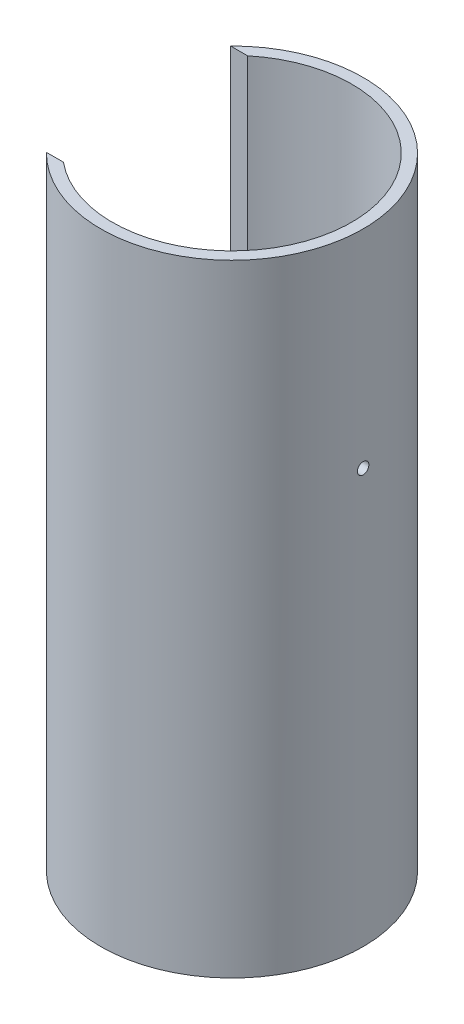
ISO-10303-21;
HEADER;
FILE_DESCRIPTION(('STEP AP214'),'2;1');
FILE_NAME('part.step','',(''),(''),'','','');
FILE_SCHEMA(('AUTOMOTIVE_DESIGN { 1 0 10303 214 1 1 1 1 }'));
ENDSEC;
DATA;
#1=APPLICATION_CONTEXT('core data for automotive mechanical design processes');
#2=APPLICATION_PROTOCOL_DEFINITION('international standard','automotive_design',2000,#1);
#3=PRODUCT_CONTEXT('',#1,'mechanical');
#4=PRODUCT('Part','Part','',(#3));
#5=PRODUCT_RELATED_PRODUCT_CATEGORY('part','',(#4));
#6=PRODUCT_DEFINITION_FORMATION('','',#4);
#7=PRODUCT_DEFINITION_CONTEXT('part definition',#1,'design');
#8=PRODUCT_DEFINITION('design','',#6,#7);
#9=PRODUCT_DEFINITION_SHAPE('','',#8);
#10=(LENGTH_UNIT() NAMED_UNIT(*) SI_UNIT(.MILLI.,.METRE.));
#11=(NAMED_UNIT(*) PLANE_ANGLE_UNIT() SI_UNIT($,.RADIAN.));
#12=(NAMED_UNIT(*) SI_UNIT($,.STERADIAN.) SOLID_ANGLE_UNIT());
#13=UNCERTAINTY_MEASURE_WITH_UNIT(LENGTH_MEASURE(1.E-05),#10,'distance_accuracy_value','');
#14=(GEOMETRIC_REPRESENTATION_CONTEXT(3) GLOBAL_UNCERTAINTY_ASSIGNED_CONTEXT((#13)) GLOBAL_UNIT_ASSIGNED_CONTEXT((#10,
#11,#12)) REPRESENTATION_CONTEXT('',''));
#15=CARTESIAN_POINT('',(0.,0.,0.));
#16=DIRECTION('',(0.,0.,1.));
#17=DIRECTION('',(1.,0.,0.));
#18=AXIS2_PLACEMENT_3D('',#15,#16,#17);
#19=CARTESIAN_POINT('',(0.,270.,0.));
#20=DIRECTION('',(0.,-1.,0.));
#21=DIRECTION('',(0.,0.,-1.));
#22=AXIS2_PLACEMENT_3D('',#19,#20,#21);
#23=CYLINDRICAL_SURFACE('',#22,52.);
#24=CARTESIAN_POINT('',(0.,0.,0.));
#25=DIRECTION('',(0.,1.,0.));
#26=DIRECTION('',(0.,0.,1.));
#27=AXIS2_PLACEMENT_3D('',#24,#25,#26);
#28=CIRCLE('',#27,52.);
#29=CARTESIAN_POINT('',(0.,0.,52.));
#30=VERTEX_POINT('',#29);
#31=EDGE_CURVE('E100',#30,#30,#28,.T.);
#32=ORIENTED_EDGE('',*,*,#31,.F.);
#33=EDGE_LOOP('',(#32));
#34=FACE_BOUND('',#33,.T.);
#35=CARTESIAN_POINT('',(0.,270.,0.));
#36=DIRECTION('',(0.,1.,0.));
#37=DIRECTION('',(0.,0.,1.));
#38=AXIS2_PLACEMENT_3D('',#35,#36,#37);
#39=CIRCLE('',#38,52.);
#40=CARTESIAN_POINT('',(-33.2264954516725,270.,39.9999999999998));
#41=VERTEX_POINT('',#40);
#42=CARTESIAN_POINT('',(-33.2264954516721,270.,-40.0000000000002));
#43=VERTEX_POINT('',#42);
#44=EDGE_CURVE('E109',#41,#43,#39,.T.);
#45=ORIENTED_EDGE('',*,*,#44,.T.);
#46=DIRECTION('',(0.,-1.,0.));
#47=VECTOR('',#46,1.);
#48=CARTESIAN_POINT('',(-33.2264954516721,270.,-40.0000000000002));
#49=LINE('',#48,#47);
#50=CARTESIAN_POINT('',(-33.2264954516721,80.4884974931799,-40.0000000000002));
#51=VERTEX_POINT('',#50);
#52=EDGE_CURVE('E88',#43,#51,#49,.T.);
#53=ORIENTED_EDGE('',*,*,#52,.T.);
#54=CARTESIAN_POINT('',(0.,138.038475772933,0.));
#55=DIRECTION('',(-0.866025403784442,0.499999999999995,0.));
#56=DIRECTION('',(-0.499999999999995,-0.866025403784442,0.));
#57=AXIS2_PLACEMENT_3D('',#54,#55,#56);
#58=ELLIPSE('',#57,104.000000000001,52.);
#59=CARTESIAN_POINT('',(-33.2264954516725,80.4884974931792,39.9999999999998));
#60=VERTEX_POINT('',#59);
#61=EDGE_CURVE('E83',#51,#60,#58,.T.);
#62=ORIENTED_EDGE('',*,*,#61,.T.);
#63=DIRECTION('',(0.,-1.,0.));
#64=VECTOR('',#63,1.);
#65=CARTESIAN_POINT('',(-33.2264954516725,270.,39.9999999999998));
#66=LINE('',#65,#64);
#67=EDGE_CURVE('E112',#60,#41,#66,.F.);
#68=ORIENTED_EDGE('',*,*,#67,.T.);
#69=EDGE_LOOP('',(#45,#53,#62,#68));
#70=FACE_BOUND('',#69,.T.);
#71=CARTESIAN_POINT('',(51.9398690795424,180.,2.50000000000002));
#72=CARTESIAN_POINT('',(51.9398698877251,179.85966099347,2.49999380392899));
#73=CARTESIAN_POINT('',(51.9404439763664,179.719222293602,2.4881432912713));
#74=CARTESIAN_POINT('',(51.9426787211842,179.442218624341,2.44103704050154));
#75=CARTESIAN_POINT('',(51.9443406596585,179.305658425168,2.40575368031589));
#76=CARTESIAN_POINT('',(51.9485624146755,179.040464549569,2.31279385035021));
#77=CARTESIAN_POINT('',(51.9511217756166,178.911826889931,2.25512874170481));
#78=CARTESIAN_POINT('',(51.9568494111344,178.666092159121,2.11905962490106));
#79=CARTESIAN_POINT('',(51.9600175413525,178.54899236189,2.04066053178103));
#80=CARTESIAN_POINT('',(51.9666091620992,178.329511521978,1.86526599192956));
#81=CARTESIAN_POINT('',(51.9700328616201,178.227142730359,1.76825522141113));
#82=CARTESIAN_POINT('',(51.9767478581374,178.040134137084,1.55842150104542));
#83=CARTESIAN_POINT('',(51.9800391497406,177.955495057002,1.44559790795081));
#84=CARTESIAN_POINT('',(51.9861199972316,177.806315731241,1.20727830652829));
#85=CARTESIAN_POINT('',(51.9889093183989,177.741784877867,1.08177641245468));
#86=CARTESIAN_POINT('',(51.9936698065947,177.634714123814,0.821704220111246));
#87=CARTESIAN_POINT('',(51.9956409794713,177.592174065948,0.687133986668528));
#88=CARTESIAN_POINT('',(51.9985416517946,177.530324408697,0.412856414303844));
#89=CARTESIAN_POINT('',(51.9994719632304,177.510996700201,0.273153167713358));
#90=CARTESIAN_POINT('',(52.0001887949155,177.496064504932,-0.0075177206885541));
#91=CARTESIAN_POINT('',(51.9999753236431,177.500459842308,-0.148485353119899));
#92=CARTESIAN_POINT('',(51.9984293313726,177.532833925389,-0.427560838715849));
#93=CARTESIAN_POINT('',(51.9970977354395,177.560793175883,-0.565670959250697));
#94=CARTESIAN_POINT('',(51.9934665575373,177.639471209598,-0.835235187038885));
#95=CARTESIAN_POINT('',(51.9911669717355,177.690190082937,-0.96668926793487));
#96=CARTESIAN_POINT('',(51.9858572705386,177.812969886158,-1.21927270336453));
#97=CARTESIAN_POINT('',(51.9828468593226,177.885039704755,-1.34039773065875));
#98=CARTESIAN_POINT('',(51.9764545554062,178.048469101553,-1.56883745605855));
#99=CARTESIAN_POINT('',(51.9730726602916,178.139828805123,-1.67615206440024));
#100=CARTESIAN_POINT('',(51.9663142337273,178.339354831265,-1.8740383746559));
#101=CARTESIAN_POINT('',(51.9629377111681,178.447538067229,-1.96459302421276));
#102=CARTESIAN_POINT('',(51.9565741314063,178.677580791009,-2.12625755002522));
#103=CARTESIAN_POINT('',(51.9535870743014,178.799440282259,-2.19736742139875));
#104=CARTESIAN_POINT('',(51.94833953179,179.05338658627,-2.31812231322526));
#105=CARTESIAN_POINT('',(51.9460790677379,179.185473699476,-2.36776670283095));
#106=CARTESIAN_POINT('',(51.942540446289,179.456121168953,-2.4441700692522));
#107=CARTESIAN_POINT('',(51.9412622820613,179.594681480201,-2.47092920521391));
#108=CARTESIAN_POINT('',(51.939833657698,179.874193605354,-2.50078140028988));
#109=CARTESIAN_POINT('',(51.9396820700089,180.015142886521,-2.5038981223882));
#110=CARTESIAN_POINT('',(51.9405207496073,180.295562461242,-2.48643875871233));
#111=CARTESIAN_POINT('',(51.9415110134084,180.43503275931,-2.46586274527748));
#112=CARTESIAN_POINT('',(51.9445207524595,180.708468903372,-2.40162161027664));
#113=CARTESIAN_POINT('',(51.9465397453045,180.8424372976,-2.35796731052076));
#114=CARTESIAN_POINT('',(51.9513789686177,181.10114523462,-2.24881974125971));
#115=CARTESIAN_POINT('',(51.9541992033679,181.225884728086,-2.1833263550426));
#116=CARTESIAN_POINT('',(51.960325782896,181.462702849845,-2.03229896610143));
#117=CARTESIAN_POINT('',(51.9636325125735,181.574771327912,-1.94674906318047));
#118=CARTESIAN_POINT('',(51.970358016835,181.782964122,-1.7580603311612));
#119=CARTESIAN_POINT('',(51.9737767920844,181.879088343321,-1.65492139760152));
#120=CARTESIAN_POINT('',(51.9803443448003,182.05274346704,-1.43388073718953));
#121=CARTESIAN_POINT('',(51.9834928990073,182.130259088058,-1.31596699737229));
#122=CARTESIAN_POINT('',(51.9891619658802,182.264392166152,-1.06878463620905));
#123=CARTESIAN_POINT('',(51.9916824811251,182.32100970905,-0.939516061496665));
#124=CARTESIAN_POINT('',(51.9958103326942,182.411712730715,-0.673350427699059));
#125=CARTESIAN_POINT('',(51.9974180657573,182.445807999797,-0.536456711320945));
#126=CARTESIAN_POINT('',(51.9995407347622,182.490530699689,-0.258879848855558));
#127=CARTESIAN_POINT('',(52.0000556762552,182.501158249712,-0.118196722021564));
#128=CARTESIAN_POINT('',(51.9999347532676,182.498642680547,0.162813731558451));
#129=CARTESIAN_POINT('',(51.9993000496874,182.485523540545,0.303141274096285));
#130=CARTESIAN_POINT('',(51.9969535815984,182.435936541774,0.57959915102851));
#131=CARTESIAN_POINT('',(51.9952418150458,182.3994686387,0.715729477457988));
#132=CARTESIAN_POINT('',(51.9909338311244,182.304224114436,0.97993395733898));
#133=CARTESIAN_POINT('',(51.9883376059352,182.24544729599,1.10800803954506));
#134=CARTESIAN_POINT('',(51.9825527493823,182.107257755848,1.35247133076744));
#135=CARTESIAN_POINT('',(51.9793641365847,182.027845680856,1.46886090581475));
#136=CARTESIAN_POINT('',(51.9727497888821,181.850554703308,1.68677064394442));
#137=CARTESIAN_POINT('',(51.9693238430144,181.7526592342,1.78827732145014));
#138=CARTESIAN_POINT('',(51.9626223164292,181.541188436009,1.97344668824445));
#139=CARTESIAN_POINT('',(51.9593467729423,181.42760925217,2.05710497783809));
#140=CARTESIAN_POINT('',(51.9533134122306,181.18791110784,2.20423909171157));
#141=CARTESIAN_POINT('',(51.9505560754622,181.061780674497,2.26769622389242));
#142=CARTESIAN_POINT('',(51.9458778079842,180.800737426243,2.37245748075221));
#143=CARTESIAN_POINT('',(51.9439558887213,180.665835209619,2.41378780167561));
#144=CARTESIAN_POINT('',(51.9416746391871,180.441744296266,2.46226792204854));
#145=CARTESIAN_POINT('',(51.9410005351568,180.354007459926,2.4763994172873));
#146=CARTESIAN_POINT('',(51.9400974998671,180.177527048551,2.49526741248901));
#147=CARTESIAN_POINT('',(51.939868568257,180.088783474308,2.50000391985613));
#148=CARTESIAN_POINT('',(51.9398690795424,180.,2.50000000000002));
#149=B_SPLINE_CURVE_WITH_KNOTS('',3,(#71,#72,#73,#74,#75,#76,#77,#78,#79,#80,#81,#82,#83,#84,
#85,#86,#87,#88,#89,#90,#91,#92,#93,#94,#95,#96,#97,#98,#99,#100,#101,#102,#103,#104,#105,#106,
#107,#108,#109,#110,#111,#112,#113,#114,#115,#116,#117,#118,#119,#120,#121,#122,#123,#124,#125,
#126,#127,#128,#129,#130,#131,#132,#133,#134,#135,#136,#137,#138,#139,#140,#141,#142,#143,#144,
#145,#146,#147,#148),.UNSPECIFIED.,.T.,.F.,(4,2,2,2,2,2,2,2,2,2,2,2,2,2,2,2,2,2,2,2,2,2,2,2,2,2,
2,2,2,2,2,2,2,2,2,2,2,2,4),(0.,0.420692928415116,0.841882641748107,1.26285883521012,
1.68373532461486,2.10495983835314,2.52620149199325,2.94763960850495,3.36907471258895,
3.79018082012403,4.21128380618504,4.63203874133232,5.05279534250337,5.47372735764895,
5.89466210859738,6.31602281151622,6.73738362022743,7.15875681143533,7.58012707235141,
8.00107554067587,8.42202272375188,8.84277269222273,9.263524909292,9.68461182065185,
10.1057012329367,10.5271352698503,10.9485675760408,11.3698165670418,11.7910634181597,
12.2118851354223,12.6327076512146,13.0535338880299,13.4743469378497,13.8955389658444,
14.3168346996087,14.7385191321554,15.1597032162891,15.425848817295,15.6919942085521),.UNSPECIFIED.);
#150=CARTESIAN_POINT('',(51.9398690795424,180.,2.50000000000002));
#151=VERTEX_POINT('',#150);
#152=EDGE_CURVE('E95',#151,#151,#149,.T.);
#153=ORIENTED_EDGE('',*,*,#152,.T.);
#154=EDGE_LOOP('',(#153));
#155=FACE_BOUND('',#154,.T.);
#156=ADVANCED_FACE('F36',(#34,#70,#155),#23,.F.);
#157=CARTESIAN_POINT('',(0.,270.,0.));
#158=DIRECTION('',(0.,-1.,0.));
#159=DIRECTION('',(0.,0.,-1.));
#160=AXIS2_PLACEMENT_3D('',#157,#158,#159);
#161=CYLINDRICAL_SURFACE('',#160,57.);
#162=DIRECTION('',(0.,-1.,0.));
#163=VECTOR('',#162,1.);
#164=CARTESIAN_POINT('',(-40.6078810084941,270.,39.9999999999998));
#165=LINE('',#164,#163);
#166=CARTESIAN_POINT('',(-40.6078810084941,67.7035626785089,39.9999999999998));
#167=VERTEX_POINT('',#166);
#168=CARTESIAN_POINT('',(-40.6078810084941,270.,39.9999999999998));
#169=VERTEX_POINT('',#168);
#170=EDGE_CURVE('E48',#167,#169,#165,.F.);
#171=ORIENTED_EDGE('',*,*,#170,.F.);
#172=CARTESIAN_POINT('',(0.,138.038475772933,0.));
#173=DIRECTION('',(-0.866025403784442,0.499999999999995,0.));
#174=DIRECTION('',(-0.499999999999995,-0.866025403784442,0.));
#175=AXIS2_PLACEMENT_3D('',#172,#173,#174);
#176=ELLIPSE('',#175,114.000000000001,57.);
#177=CARTESIAN_POINT('',(-40.6078810084937,67.7035626785097,-40.0000000000002));
#178=VERTEX_POINT('',#177);
#179=EDGE_CURVE('E55',#178,#167,#176,.T.);
#180=ORIENTED_EDGE('',*,*,#179,.F.);
#181=DIRECTION('',(0.,-1.,0.));
#182=VECTOR('',#181,1.);
#183=CARTESIAN_POINT('',(-40.6078810084937,270.,-40.0000000000002));
#184=LINE('',#183,#182);
#185=CARTESIAN_POINT('',(-40.6078810084937,270.,-40.0000000000002));
#186=VERTEX_POINT('',#185);
#187=EDGE_CURVE('E93',#186,#178,#184,.T.);
#188=ORIENTED_EDGE('',*,*,#187,.F.);
#189=CARTESIAN_POINT('',(0.,270.,0.));
#190=DIRECTION('',(0.,1.,0.));
#191=DIRECTION('',(0.,0.,1.));
#192=AXIS2_PLACEMENT_3D('',#189,#190,#191);
#193=CIRCLE('',#192,57.);
#194=EDGE_CURVE('E63',#169,#186,#193,.T.);
#195=ORIENTED_EDGE('',*,*,#194,.F.);
#196=EDGE_LOOP('',(#171,#180,#188,#195));
#197=FACE_BOUND('',#196,.T.);
#198=CARTESIAN_POINT('',(0.,0.,0.));
#199=DIRECTION('',(0.,1.,0.));
#200=DIRECTION('',(0.,0.,1.));
#201=AXIS2_PLACEMENT_3D('',#198,#199,#200);
#202=CIRCLE('',#201,57.);
#203=CARTESIAN_POINT('',(0.,0.,57.));
#204=VERTEX_POINT('',#203);
#205=EDGE_CURVE('E104',#204,#204,#202,.T.);
#206=ORIENTED_EDGE('',*,*,#205,.T.);
#207=EDGE_LOOP('',(#206));
#208=FACE_BOUND('',#207,.T.);
#209=CARTESIAN_POINT('',(57.,177.5,0.));
#210=CARTESIAN_POINT('',(56.9999992646389,177.500006201462,-0.140353692550606));
#211=CARTESIAN_POINT('',(56.9994760457185,177.511859184025,-0.280807435385509));
#212=CARTESIAN_POINT('',(56.9974391213871,177.558975819787,-0.55784178688696));
#213=CARTESIAN_POINT('',(56.9959242431764,177.594267193444,-0.69441760947785));
#214=CARTESIAN_POINT('',(56.9920754940514,177.68724956445,-0.95964282100244));
#215=CARTESIAN_POINT('',(56.9897420345578,177.7449293109,-1.08829615368288));
#216=CARTESIAN_POINT('',(56.9845190726591,177.881034229992,-1.33405911627805));
#217=CARTESIAN_POINT('',(56.9816297031697,177.959454445354,-1.45117149548272));
#218=CARTESIAN_POINT('',(56.9756174477692,178.134885790706,-1.67065838722621));
#219=CARTESIAN_POINT('',(56.9724943987938,178.231909977943,-1.77302245972415));
#220=CARTESIAN_POINT('',(56.9663681853318,178.441769691984,-1.96001826625343));
#221=CARTESIAN_POINT('',(56.9633650257015,178.554605858461,-2.04464928254801));
#222=CARTESIAN_POINT('',(56.9578161622023,178.79293806603,-2.19380288424851));
#223=CARTESIAN_POINT('',(56.9552706352591,178.918438974295,-2.25831769956301));
#224=CARTESIAN_POINT('',(56.9509259775338,179.178503809166,-2.36535759511149));
#225=CARTESIAN_POINT('',(56.9491268420516,179.313067678695,-2.40788281381657));
#226=CARTESIAN_POINT('',(56.9464792625189,179.587346058743,-2.4697098362051));
#227=CARTESIAN_POINT('',(56.9456302017576,179.727057167179,-2.48902670545226));
#228=CARTESIAN_POINT('',(56.9449766621707,180.007741397074,-2.50393516086315));
#229=CARTESIAN_POINT('',(56.9451721765699,180.148714510342,-2.4995269009079));
#230=CARTESIAN_POINT('',(56.9465851659826,180.427818728896,-2.46712281828866));
#231=CARTESIAN_POINT('',(56.9478019359677,180.565951727487,-2.43914326811985));
#232=CARTESIAN_POINT('',(56.9511191757347,180.835558308862,-2.36041604686029));
#233=CARTESIAN_POINT('',(56.9532196486079,180.967031868347,-2.30966829611988));
#234=CARTESIAN_POINT('',(56.9580683508879,181.219639967857,-2.18682659248046));
#235=CARTESIAN_POINT('',(56.9608168058029,181.340770888439,-2.11472520592463));
#236=CARTESIAN_POINT('',(56.9666514430658,181.569215636944,-1.95122836268527));
#237=CARTESIAN_POINT('',(56.969737627217,181.676529391088,-1.85983280298137));
#238=CARTESIAN_POINT('',(56.9759029930593,181.874388294845,-1.66025009398518));
#239=CARTESIAN_POINT('',(56.9789821666499,181.964919226267,-1.55204884844644));
#240=CARTESIAN_POINT('',(56.9847839272717,182.126533119827,-1.32197580343807));
#241=CARTESIAN_POINT('',(56.9875065142275,182.197616077851,-1.20010400107531));
#242=CARTESIAN_POINT('',(56.9922883255487,182.318314802743,-0.946141157730987));
#243=CARTESIAN_POINT('',(56.994347535123,182.367930090963,-0.814049888970679));
#244=CARTESIAN_POINT('',(56.9975702756469,182.444275866278,-0.543401334867235));
#245=CARTESIAN_POINT('',(56.9987338117641,182.471006485404,-0.404844086834084));
#246=CARTESIAN_POINT('',(57.0000334003163,182.500806651285,-0.125320177713949));
#247=CARTESIAN_POINT('',(57.0001703068932,182.503895867412,0.0156443826203608));
#248=CARTESIAN_POINT('',(56.9994034716879,182.48637684037,0.296089962558756));
#249=CARTESIAN_POINT('',(56.9984997325408,182.465768657208,0.435570985918628));
#250=CARTESIAN_POINT('',(56.9957539684182,182.40145610102,0.709035127866437));
#251=CARTESIAN_POINT('',(56.99391230758,182.3577606911,0.843020358335788));
#252=CARTESIAN_POINT('',(56.9894981105445,182.248523119304,1.10175455357909));
#253=CARTESIAN_POINT('',(56.986925571121,182.182980860996,1.22650347758088));
#254=CARTESIAN_POINT('',(56.9813370302305,182.031859627639,1.46331429765255));
#255=CARTESIAN_POINT('',(56.9783207370042,181.94626744807,1.57536776025048));
#256=CARTESIAN_POINT('',(56.9721854437107,181.757495345065,1.78352211174476));
#257=CARTESIAN_POINT('',(56.9690664431281,181.654315333343,1.87962292055898));
#258=CARTESIAN_POINT('',(56.9630748727783,181.433211962316,2.05321005421267));
#259=CARTESIAN_POINT('',(56.9602024721662,181.31527861709,2.13068366629651));
#260=CARTESIAN_POINT('',(56.9550306432213,181.068066869862,2.26473034035058));
#261=CARTESIAN_POINT('',(56.9527312128256,180.938788508705,2.32130347756349));
#262=CARTESIAN_POINT('',(56.94896581267,180.672603839812,2.41192107888779));
#263=CARTESIAN_POINT('',(56.9474995415243,180.535700310095,2.44597369026943));
#264=CARTESIAN_POINT('',(56.9455649478234,180.258112478422,2.49061027607693));
#265=CARTESIAN_POINT('',(56.9450966213312,180.117428191384,2.50119434308828));
#266=CARTESIAN_POINT('',(56.9452108324331,179.83639902865,2.49859246118059));
#267=CARTESIAN_POINT('',(56.94579248543,179.696053966899,2.48542652141344));
#268=CARTESIAN_POINT('',(56.9479392272305,179.419568619829,2.43573966059012));
#269=CARTESIAN_POINT('',(56.9495043179393,179.283428342656,2.39921869429163));
#270=CARTESIAN_POINT('',(56.9534413384817,179.019212175689,2.3038622948098));
#271=CARTESIAN_POINT('',(56.9558132776653,178.89113637937,2.24502660303452));
#272=CARTESIAN_POINT('',(56.9610965546845,178.646680500445,2.10671491993146));
#273=CARTESIAN_POINT('',(56.964007874907,178.530300036128,2.02723960254076));
#274=CARTESIAN_POINT('',(56.9700445042915,178.312439824711,1.84983512278238));
#275=CARTESIAN_POINT('',(56.9731699690179,178.210971082112,1.75189245242291));
#276=CARTESIAN_POINT('',(56.979281712617,178.025886047041,1.54033410922755));
#277=CARTESIAN_POINT('',(56.9822679569794,177.942274162785,1.42671457770706));
#278=CARTESIAN_POINT('',(56.9877664045194,177.795246230735,1.18695480328423));
#279=CARTESIAN_POINT('',(56.9902782047117,177.731847320358,1.06080405409163));
#280=CARTESIAN_POINT('',(56.9945383322885,177.627204405783,0.799733287089196));
#281=CARTESIAN_POINT('',(56.9962875641053,177.585934142807,0.664823876846485));
#282=CARTESIAN_POINT('',(56.9983610373897,177.537585640273,0.440892631949623));
#283=CARTESIAN_POINT('',(56.9989729596849,177.523508925801,0.353322375818431));
#284=CARTESIAN_POINT('',(56.9997926729901,177.504714151082,0.177181372298448));
#285=CARTESIAN_POINT('',(57.0000004642615,177.499996084781,0.0886106255567912));
#286=CARTESIAN_POINT('',(57.,177.5,0.));
#287=B_SPLINE_CURVE_WITH_KNOTS('',3,(#209,#210,#211,#212,#213,#214,#215,#216,#217,#218,#219,
#220,#221,#222,#223,#224,#225,#226,#227,#228,#229,#230,#231,#232,#233,#234,#235,#236,#237,#238,
#239,#240,#241,#242,#243,#244,#245,#246,#247,#248,#249,#250,#251,#252,#253,#254,#255,#256,#257,
#258,#259,#260,#261,#262,#263,#264,#265,#266,#267,#268,#269,#270,#271,#272,#273,#274,#275,#276,
#277,#278,#279,#280,#281,#282,#283,#284,#285,#286),.UNSPECIFIED.,.T.,.F.,(4,2,2,2,2,2,2,2,2,2,2,
2,2,2,2,2,2,2,2,2,2,2,2,2,2,2,2,2,2,2,2,2,2,2,2,2,2,2,4),(0.,0.420737623648742,
0.841973739655536,1.26299844408949,1.68392260818189,2.10514328760483,2.52638101243675,
2.94778124372887,3.36917882138138,3.79030270321808,4.21142385365134,4.6322545201255,
5.05308665879665,5.47406547067473,5.89504653040691,6.31638262612172,6.7377188110048,
7.15906438963619,7.58040753732041,8.00140009425088,8.42239158512447,8.84321975532689,
9.26404978309546,9.68515774509559,10.1062678209888,10.5276644869303,10.9490596358094,
11.3703022526837,11.7915432077157,12.2124294370345,12.6333164816779,13.0542084038773,
13.4750865845963,13.8962738204381,14.3175649123784,14.7392122487202,15.1603581271382,
15.4259859667941,15.6916136346473),.UNSPECIFIED.);
#288=CARTESIAN_POINT('',(57.,177.5,0.));
#289=VERTEX_POINT('',#288);
#290=EDGE_CURVE('E11',#289,#289,#287,.T.);
#291=ORIENTED_EDGE('',*,*,#290,.F.);
#292=EDGE_LOOP('',(#291));
#293=FACE_BOUND('',#292,.T.);
#294=ADVANCED_FACE('F91',(#197,#208,#293),#161,.T.);
#295=CARTESIAN_POINT('',(57.0100000000001,270.,40.0000000000005));
#296=DIRECTION('',(0.,0.,-1.));
#297=DIRECTION('',(-1.,0.,0.));
#298=AXIS2_PLACEMENT_3D('',#295,#296,#297);
#299=PLANE('',#298);
#300=DIRECTION('',(-0.499999999999995,-0.866025403784442,0.));
#301=VECTOR('',#300,1.);
#302=CARTESIAN_POINT('',(76.3069211874373,270.20594023873,40.0000000000006));
#303=LINE('',#302,#301);
#304=EDGE_CURVE('E116',#60,#167,#303,.T.);
#305=ORIENTED_EDGE('',*,*,#304,.T.);
#306=ORIENTED_EDGE('',*,*,#170,.T.);
#307=DIRECTION('',(-1.,0.,0.));
#308=VECTOR('',#307,1.);
#309=CARTESIAN_POINT('',(-2.79318507107451E-13,270.,40.0000000000001));
#310=LINE('',#309,#308);
#311=EDGE_CURVE('E114',#41,#169,#310,.T.);
#312=ORIENTED_EDGE('',*,*,#311,.F.);
#313=ORIENTED_EDGE('',*,*,#67,.F.);
#314=EDGE_LOOP('',(#305,#306,#312,#313));
#315=FACE_BOUND('',#314,.T.);
#316=ADVANCED_FACE('F38',(#315),#299,.T.);
#317=CARTESIAN_POINT('',(0.,270.,0.));
#318=DIRECTION('',(0.,1.,0.));
#319=DIRECTION('',(0.,0.,1.));
#320=AXIS2_PLACEMENT_3D('',#317,#318,#319);
#321=PLANE('',#320);
#322=ORIENTED_EDGE('',*,*,#194,.T.);
#323=DIRECTION('',(-1.,0.,0.));
#324=VECTOR('',#323,1.);
#325=CARTESIAN_POINT('',(57.0100000000007,270.,-39.9999999999995));
#326=LINE('',#325,#324);
#327=EDGE_CURVE('E89',#43,#186,#326,.T.);
#328=ORIENTED_EDGE('',*,*,#327,.F.);
#329=ORIENTED_EDGE('',*,*,#44,.F.);
#330=ORIENTED_EDGE('',*,*,#311,.T.);
#331=EDGE_LOOP('',(#322,#328,#329,#330));
#332=FACE_BOUND('',#331,.T.);
#333=ADVANCED_FACE('F146',(#332),#321,.T.);
#334=CARTESIAN_POINT('',(57.0100000000007,270.,-39.9999999999995));
#335=DIRECTION('',(0.,0.,1.));
#336=DIRECTION('',(1.,0.,0.));
#337=AXIS2_PLACEMENT_3D('',#334,#335,#336);
#338=PLANE('',#337);
#339=ORIENTED_EDGE('',*,*,#327,.T.);
#340=ORIENTED_EDGE('',*,*,#187,.T.);
#341=DIRECTION('',(0.499999999999995,0.866025403784442,0.));
#342=VECTOR('',#341,1.);
#343=CARTESIAN_POINT('',(76.3069211874375,270.205940238731,-39.9999999999994));
#344=LINE('',#343,#342);
#345=EDGE_CURVE('E80',#178,#51,#344,.T.);
#346=ORIENTED_EDGE('',*,*,#345,.T.);
#347=ORIENTED_EDGE('',*,*,#52,.F.);
#348=EDGE_LOOP('',(#339,#340,#346,#347));
#349=FACE_BOUND('',#348,.T.);
#350=ADVANCED_FACE('F98',(#349),#338,.T.);
#351=CARTESIAN_POINT('',(76.3069211874375,270.205940238731,-57.01));
#352=DIRECTION('',(-0.866025403784442,0.499999999999995,0.));
#353=DIRECTION('',(-0.499999999999995,-0.866025403784442,0.));
#354=AXIS2_PLACEMENT_3D('',#351,#352,#353);
#355=PLANE('',#354);
#356=ORIENTED_EDGE('',*,*,#345,.F.);
#357=ORIENTED_EDGE('',*,*,#179,.T.);
#358=ORIENTED_EDGE('',*,*,#304,.F.);
#359=ORIENTED_EDGE('',*,*,#61,.F.);
#360=EDGE_LOOP('',(#356,#357,#358,#359));
#361=FACE_BOUND('',#360,.T.);
#362=ADVANCED_FACE('F81',(#361),#355,.T.);
#363=CARTESIAN_POINT('',(0.,0.,0.));
#364=DIRECTION('',(0.,1.,0.));
#365=DIRECTION('',(0.,0.,1.));
#366=AXIS2_PLACEMENT_3D('',#363,#364,#365);
#367=PLANE('',#366);
#368=ORIENTED_EDGE('',*,*,#205,.F.);
#369=EDGE_LOOP('',(#368));
#370=FACE_BOUND('',#369,.T.);
#371=ORIENTED_EDGE('',*,*,#31,.T.);
#372=EDGE_LOOP('',(#371));
#373=FACE_BOUND('',#372,.T.);
#374=ADVANCED_FACE('F138',(#370,#373),#367,.F.);
#375=CARTESIAN_POINT('',(57.,180.,0.));
#376=DIRECTION('',(-1.,0.,0.));
#377=DIRECTION('',(0.,0.,1.));
#378=AXIS2_PLACEMENT_3D('',#375,#376,#377);
#379=CYLINDRICAL_SURFACE('',#378,2.5);
#380=ORIENTED_EDGE('',*,*,#152,.F.);
#381=EDGE_LOOP('',(#380));
#382=FACE_BOUND('',#381,.T.);
#383=ORIENTED_EDGE('',*,*,#290,.T.);
#384=EDGE_LOOP('',(#383));
#385=FACE_BOUND('',#384,.T.);
#386=ADVANCED_FACE('F134',(#382,#385),#379,.F.);
#387=CLOSED_SHELL('',(#156,#294,#316,#333,#350,#362,#374,#386));
#388=MANIFOLD_SOLID_BREP('B2',#387);
#389=ADVANCED_BREP_SHAPE_REPRESENTATION('',(#18,#388),#14);
#390=SHAPE_DEFINITION_REPRESENTATION(#9,#389);
ENDSEC;
END-ISO-10303-21;
